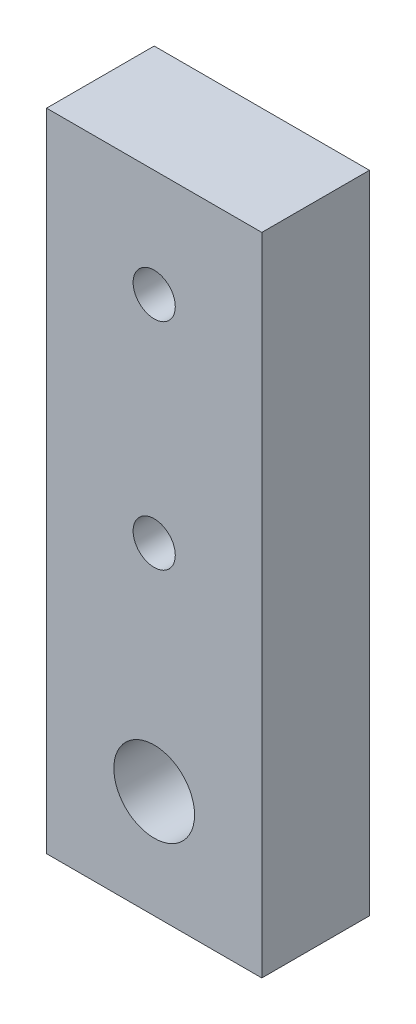
ISO-10303-21;
HEADER;
FILE_DESCRIPTION(('STEP AP214'),'2;1');
FILE_NAME('part.step','',(''),(''),'','','');
FILE_SCHEMA(('AUTOMOTIVE_DESIGN { 1 0 10303 214 1 1 1 1 }'));
ENDSEC;
DATA;
#1=APPLICATION_CONTEXT('core data for automotive mechanical design processes');
#2=APPLICATION_PROTOCOL_DEFINITION('international standard','automotive_design',2000,#1);
#3=PRODUCT_CONTEXT('',#1,'mechanical');
#4=PRODUCT('Part','Part','',(#3));
#5=PRODUCT_RELATED_PRODUCT_CATEGORY('part','',(#4));
#6=PRODUCT_DEFINITION_FORMATION('','',#4);
#7=PRODUCT_DEFINITION_CONTEXT('part definition',#1,'design');
#8=PRODUCT_DEFINITION('design','',#6,#7);
#9=PRODUCT_DEFINITION_SHAPE('','',#8);
#10=(LENGTH_UNIT() NAMED_UNIT(*) SI_UNIT(.MILLI.,.METRE.));
#11=(NAMED_UNIT(*) PLANE_ANGLE_UNIT() SI_UNIT($,.RADIAN.));
#12=(NAMED_UNIT(*) SI_UNIT($,.STERADIAN.) SOLID_ANGLE_UNIT());
#13=UNCERTAINTY_MEASURE_WITH_UNIT(LENGTH_MEASURE(1.E-05),#10,'distance_accuracy_value','');
#14=(GEOMETRIC_REPRESENTATION_CONTEXT(3) GLOBAL_UNCERTAINTY_ASSIGNED_CONTEXT((#13)) GLOBAL_UNIT_ASSIGNED_CONTEXT((#10,
#11,#12)) REPRESENTATION_CONTEXT('',''));
#15=CARTESIAN_POINT('',(0.,0.,0.));
#16=DIRECTION('',(0.,0.,1.));
#17=DIRECTION('',(1.,0.,0.));
#18=AXIS2_PLACEMENT_3D('',#15,#16,#17);
#19=CARTESIAN_POINT('',(19.0500000000001,709.3585,-12.7));
#20=DIRECTION('',(-1.,0.,0.));
#21=DIRECTION('',(0.,-1.,0.));
#22=AXIS2_PLACEMENT_3D('',#19,#20,#21);
#23=PLANE('',#22);
#24=DIRECTION('',(0.,-1.,0.));
#25=VECTOR('',#24,1.);
#26=CARTESIAN_POINT('',(19.0500000000001,709.3585,0.));
#27=LINE('',#26,#25);
#28=CARTESIAN_POINT('',(19.0500000000001,709.3585,0.));
#29=VERTEX_POINT('',#28);
#30=CARTESIAN_POINT('',(19.0500000000001,633.1585,0.));
#31=VERTEX_POINT('',#30);
#32=EDGE_CURVE('E104',#29,#31,#27,.T.);
#33=ORIENTED_EDGE('',*,*,#32,.F.);
#34=DIRECTION('',(0.,0.,1.));
#35=VECTOR('',#34,1.);
#36=CARTESIAN_POINT('',(19.0500000000001,709.3585,-12.7));
#37=LINE('',#36,#35);
#38=CARTESIAN_POINT('',(19.0500000000001,709.3585,-12.7));
#39=VERTEX_POINT('',#38);
#40=EDGE_CURVE('E11',#39,#29,#37,.T.);
#41=ORIENTED_EDGE('',*,*,#40,.F.);
#42=DIRECTION('',(0.,-1.,0.));
#43=VECTOR('',#42,1.);
#44=CARTESIAN_POINT('',(19.0500000000001,709.3585,-12.7));
#45=LINE('',#44,#43);
#46=CARTESIAN_POINT('',(19.0500000000001,633.1585,-12.7));
#47=VERTEX_POINT('',#46);
#48=EDGE_CURVE('E97',#39,#47,#45,.T.);
#49=ORIENTED_EDGE('',*,*,#48,.T.);
#50=DIRECTION('',(0.,0.,1.));
#51=VECTOR('',#50,1.);
#52=CARTESIAN_POINT('',(19.0500000000001,633.1585,-12.7));
#53=LINE('',#52,#51);
#54=EDGE_CURVE('E42',#47,#31,#53,.T.);
#55=ORIENTED_EDGE('',*,*,#54,.T.);
#56=EDGE_LOOP('',(#33,#41,#49,#55));
#57=FACE_BOUND('',#56,.T.);
#58=ADVANCED_FACE('F39',(#57),#23,.T.);
#59=CARTESIAN_POINT('',(19.0500000000001,709.3585,-12.7));
#60=DIRECTION('',(0.,1.,0.));
#61=DIRECTION('',(0.,0.,1.));
#62=AXIS2_PLACEMENT_3D('',#59,#60,#61);
#63=PLANE('',#62);
#64=DIRECTION('',(-1.,0.,0.));
#65=VECTOR('',#64,1.);
#66=CARTESIAN_POINT('',(19.0500000000001,709.3585,0.));
#67=LINE('',#66,#65);
#68=CARTESIAN_POINT('',(44.4500000000001,709.3585,0.));
#69=VERTEX_POINT('',#68);
#70=EDGE_CURVE('E99',#69,#29,#67,.T.);
#71=ORIENTED_EDGE('',*,*,#70,.F.);
#72=DIRECTION('',(0.,0.,1.));
#73=VECTOR('',#72,1.);
#74=CARTESIAN_POINT('',(44.4500000000001,709.3585,-12.7));
#75=LINE('',#74,#73);
#76=CARTESIAN_POINT('',(44.4500000000001,709.3585,-12.7));
#77=VERTEX_POINT('',#76);
#78=EDGE_CURVE('E48',#77,#69,#75,.T.);
#79=ORIENTED_EDGE('',*,*,#78,.F.);
#80=DIRECTION('',(-1.,0.,0.));
#81=VECTOR('',#80,1.);
#82=CARTESIAN_POINT('',(19.0500000000001,709.3585,-12.7));
#83=LINE('',#82,#81);
#84=EDGE_CURVE('E94',#77,#39,#83,.T.);
#85=ORIENTED_EDGE('',*,*,#84,.T.);
#86=ORIENTED_EDGE('',*,*,#40,.T.);
#87=EDGE_LOOP('',(#71,#79,#85,#86));
#88=FACE_BOUND('',#87,.T.);
#89=ADVANCED_FACE('F115',(#88),#63,.T.);
#90=CARTESIAN_POINT('',(44.4500000000001,709.3585,-12.7));
#91=DIRECTION('',(1.,0.,0.));
#92=DIRECTION('',(0.,1.,0.));
#93=AXIS2_PLACEMENT_3D('',#90,#91,#92);
#94=PLANE('',#93);
#95=DIRECTION('',(0.,1.,0.));
#96=VECTOR('',#95,1.);
#97=CARTESIAN_POINT('',(44.4500000000001,709.3585,0.));
#98=LINE('',#97,#96);
#99=CARTESIAN_POINT('',(44.4500000000001,633.1585,0.));
#100=VERTEX_POINT('',#99);
#101=EDGE_CURVE('E89',#100,#69,#98,.T.);
#102=ORIENTED_EDGE('',*,*,#101,.F.);
#103=DIRECTION('',(0.,0.,1.));
#104=VECTOR('',#103,1.);
#105=CARTESIAN_POINT('',(44.4500000000001,633.1585,-12.7));
#106=LINE('',#105,#104);
#107=CARTESIAN_POINT('',(44.4500000000001,633.1585,-12.7));
#108=VERTEX_POINT('',#107);
#109=EDGE_CURVE('E84',#108,#100,#106,.T.);
#110=ORIENTED_EDGE('',*,*,#109,.F.);
#111=DIRECTION('',(0.,1.,0.));
#112=VECTOR('',#111,1.);
#113=CARTESIAN_POINT('',(44.4500000000001,709.3585,-12.7));
#114=LINE('',#113,#112);
#115=EDGE_CURVE('E87',#108,#77,#114,.T.);
#116=ORIENTED_EDGE('',*,*,#115,.T.);
#117=ORIENTED_EDGE('',*,*,#78,.T.);
#118=EDGE_LOOP('',(#102,#110,#116,#117));
#119=FACE_BOUND('',#118,.T.);
#120=ADVANCED_FACE('F86',(#119),#94,.T.);
#121=CARTESIAN_POINT('',(19.0500000000001,633.1585,-12.7));
#122=DIRECTION('',(0.,-1.,0.));
#123=DIRECTION('',(0.,0.,-1.));
#124=AXIS2_PLACEMENT_3D('',#121,#122,#123);
#125=PLANE('',#124);
#126=DIRECTION('',(1.,0.,0.));
#127=VECTOR('',#126,1.);
#128=CARTESIAN_POINT('',(19.0500000000001,633.1585,0.));
#129=LINE('',#128,#127);
#130=EDGE_CURVE('E107',#31,#100,#129,.T.);
#131=ORIENTED_EDGE('',*,*,#130,.F.);
#132=ORIENTED_EDGE('',*,*,#54,.F.);
#133=DIRECTION('',(1.,0.,0.));
#134=VECTOR('',#133,1.);
#135=CARTESIAN_POINT('',(19.0500000000001,633.1585,-12.7));
#136=LINE('',#135,#134);
#137=EDGE_CURVE('E93',#47,#108,#136,.T.);
#138=ORIENTED_EDGE('',*,*,#137,.T.);
#139=ORIENTED_EDGE('',*,*,#109,.T.);
#140=EDGE_LOOP('',(#131,#132,#138,#139));
#141=FACE_BOUND('',#140,.T.);
#142=ADVANCED_FACE('F96',(#141),#125,.T.);
#143=CARTESIAN_POINT('',(0.,0.,-12.7));
#144=DIRECTION('',(0.,0.,1.));
#145=DIRECTION('',(1.,0.,0.));
#146=AXIS2_PLACEMENT_3D('',#143,#144,#145);
#147=PLANE('',#146);
#148=CARTESIAN_POINT('',(31.7500000000001,645.8585,-12.7));
#149=DIRECTION('',(0.,0.,1.));
#150=DIRECTION('',(1.,0.,0.));
#151=AXIS2_PLACEMENT_3D('',#148,#149,#150);
#152=CIRCLE('',#151,4.76250000000005);
#153=CARTESIAN_POINT('',(36.5125000000001,645.8585,-12.7));
#154=VERTEX_POINT('',#153);
#155=EDGE_CURVE('E108',#154,#154,#152,.T.);
#156=ORIENTED_EDGE('',*,*,#155,.T.);
#157=EDGE_LOOP('',(#156));
#158=FACE_BOUND('',#157,.T.);
#159=CARTESIAN_POINT('',(31.7500000000001,671.2585,-12.7));
#160=DIRECTION('',(0.,0.,1.));
#161=DIRECTION('',(1.,0.,0.));
#162=AXIS2_PLACEMENT_3D('',#159,#160,#161);
#163=CIRCLE('',#162,2.48920000000008);
#164=CARTESIAN_POINT('',(34.2392000000002,671.2585,-12.7));
#165=VERTEX_POINT('',#164);
#166=EDGE_CURVE('E159',#165,#165,#163,.T.);
#167=ORIENTED_EDGE('',*,*,#166,.T.);
#168=EDGE_LOOP('',(#167));
#169=FACE_BOUND('',#168,.T.);
#170=CARTESIAN_POINT('',(31.7500000000001,696.6585,-12.7));
#171=DIRECTION('',(0.,0.,1.));
#172=DIRECTION('',(1.,0.,0.));
#173=AXIS2_PLACEMENT_3D('',#170,#171,#172);
#174=CIRCLE('',#173,2.48920000000015);
#175=CARTESIAN_POINT('',(34.2392000000002,696.6585,-12.7));
#176=VERTEX_POINT('',#175);
#177=EDGE_CURVE('E166',#176,#176,#174,.T.);
#178=ORIENTED_EDGE('',*,*,#177,.T.);
#179=EDGE_LOOP('',(#178));
#180=FACE_BOUND('',#179,.T.);
#181=ORIENTED_EDGE('',*,*,#48,.F.);
#182=ORIENTED_EDGE('',*,*,#84,.F.);
#183=ORIENTED_EDGE('',*,*,#115,.F.);
#184=ORIENTED_EDGE('',*,*,#137,.F.);
#185=EDGE_LOOP('',(#181,#182,#183,#184));
#186=FACE_BOUND('',#185,.T.);
#187=ADVANCED_FACE('F92',(#158,#169,#180,#186),#147,.F.);
#188=CARTESIAN_POINT('',(0.,0.,0.));
#189=DIRECTION('',(0.,0.,1.));
#190=DIRECTION('',(1.,0.,0.));
#191=AXIS2_PLACEMENT_3D('',#188,#189,#190);
#192=PLANE('',#191);
#193=CARTESIAN_POINT('',(31.7500000000001,645.8585,0.));
#194=DIRECTION('',(0.,0.,1.));
#195=DIRECTION('',(1.,0.,0.));
#196=AXIS2_PLACEMENT_3D('',#193,#194,#195);
#197=CIRCLE('',#196,4.76250000000005);
#198=CARTESIAN_POINT('',(36.5125000000001,645.8585,0.));
#199=VERTEX_POINT('',#198);
#200=EDGE_CURVE('E154',#199,#199,#197,.T.);
#201=ORIENTED_EDGE('',*,*,#200,.F.);
#202=EDGE_LOOP('',(#201));
#203=FACE_BOUND('',#202,.T.);
#204=CARTESIAN_POINT('',(31.7500000000001,671.2585,0.));
#205=DIRECTION('',(0.,0.,1.));
#206=DIRECTION('',(1.,0.,0.));
#207=AXIS2_PLACEMENT_3D('',#204,#205,#206);
#208=CIRCLE('',#207,2.48920000000008);
#209=CARTESIAN_POINT('',(34.2392000000002,671.2585,0.));
#210=VERTEX_POINT('',#209);
#211=EDGE_CURVE('E155',#210,#210,#208,.T.);
#212=ORIENTED_EDGE('',*,*,#211,.F.);
#213=EDGE_LOOP('',(#212));
#214=FACE_BOUND('',#213,.T.);
#215=CARTESIAN_POINT('',(31.7500000000001,696.6585,0.));
#216=DIRECTION('',(0.,0.,1.));
#217=DIRECTION('',(1.,0.,0.));
#218=AXIS2_PLACEMENT_3D('',#215,#216,#217);
#219=CIRCLE('',#218,2.48920000000015);
#220=CARTESIAN_POINT('',(34.2392000000002,696.6585,0.));
#221=VERTEX_POINT('',#220);
#222=EDGE_CURVE('E164',#221,#221,#219,.T.);
#223=ORIENTED_EDGE('',*,*,#222,.F.);
#224=EDGE_LOOP('',(#223));
#225=FACE_BOUND('',#224,.T.);
#226=ORIENTED_EDGE('',*,*,#32,.T.);
#227=ORIENTED_EDGE('',*,*,#130,.T.);
#228=ORIENTED_EDGE('',*,*,#101,.T.);
#229=ORIENTED_EDGE('',*,*,#70,.T.);
#230=EDGE_LOOP('',(#226,#227,#228,#229));
#231=FACE_BOUND('',#230,.T.);
#232=ADVANCED_FACE('F114',(#203,#214,#225,#231),#192,.T.);
#233=CARTESIAN_POINT('',(31.7500000000001,696.6585,-12.7));
#234=DIRECTION('',(0.,0.,1.));
#235=DIRECTION('',(1.,0.,0.));
#236=AXIS2_PLACEMENT_3D('',#233,#234,#235);
#237=CYLINDRICAL_SURFACE('',#236,2.48920000000015);
#238=ORIENTED_EDGE('',*,*,#177,.F.);
#239=EDGE_LOOP('',(#238));
#240=FACE_BOUND('',#239,.T.);
#241=ORIENTED_EDGE('',*,*,#222,.T.);
#242=EDGE_LOOP('',(#241));
#243=FACE_BOUND('',#242,.T.);
#244=ADVANCED_FACE('F133',(#240,#243),#237,.F.);
#245=CARTESIAN_POINT('',(31.7500000000001,671.2585,-12.7));
#246=DIRECTION('',(0.,0.,1.));
#247=DIRECTION('',(1.,0.,0.));
#248=AXIS2_PLACEMENT_3D('',#245,#246,#247);
#249=CYLINDRICAL_SURFACE('',#248,2.48920000000008);
#250=ORIENTED_EDGE('',*,*,#166,.F.);
#251=EDGE_LOOP('',(#250));
#252=FACE_BOUND('',#251,.T.);
#253=ORIENTED_EDGE('',*,*,#211,.T.);
#254=EDGE_LOOP('',(#253));
#255=FACE_BOUND('',#254,.T.);
#256=ADVANCED_FACE('F140',(#252,#255),#249,.F.);
#257=CARTESIAN_POINT('',(31.7500000000001,645.8585,-12.7));
#258=DIRECTION('',(0.,0.,1.));
#259=DIRECTION('',(1.,0.,0.));
#260=AXIS2_PLACEMENT_3D('',#257,#258,#259);
#261=CYLINDRICAL_SURFACE('',#260,4.76250000000005);
#262=ORIENTED_EDGE('',*,*,#155,.F.);
#263=EDGE_LOOP('',(#262));
#264=FACE_BOUND('',#263,.T.);
#265=ORIENTED_EDGE('',*,*,#200,.T.);
#266=EDGE_LOOP('',(#265));
#267=FACE_BOUND('',#266,.T.);
#268=ADVANCED_FACE('F144',(#264,#267),#261,.F.);
#269=CLOSED_SHELL('',(#58,#89,#120,#142,#187,#232,#244,#256,#268));
#270=MANIFOLD_SOLID_BREP('B2',#269);
#271=ADVANCED_BREP_SHAPE_REPRESENTATION('',(#18,#270),#14);
#272=SHAPE_DEFINITION_REPRESENTATION(#9,#271);
ENDSEC;
END-ISO-10303-21;
